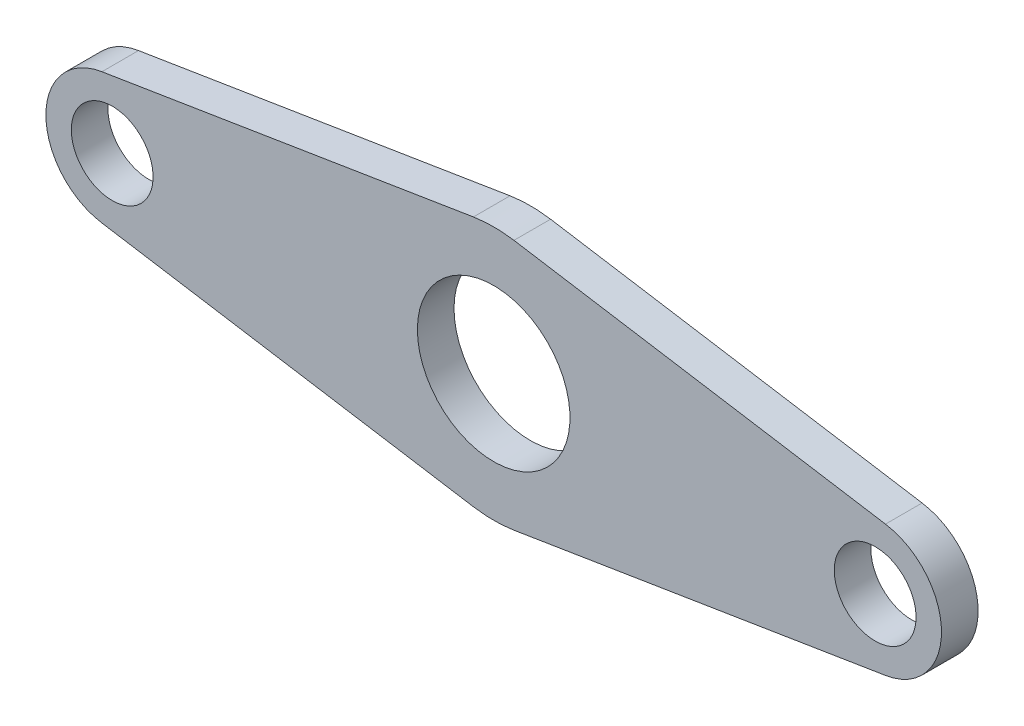
ISO-10303-21;
HEADER;
FILE_DESCRIPTION(('STEP AP214'),'2;1');
FILE_NAME('part.step','',(''),(''),'','','');
FILE_SCHEMA(('AUTOMOTIVE_DESIGN { 1 0 10303 214 1 1 1 1 }'));
ENDSEC;
DATA;
#1=APPLICATION_CONTEXT('core data for automotive mechanical design processes');
#2=APPLICATION_PROTOCOL_DEFINITION('international standard','automotive_design',2000,#1);
#3=PRODUCT_CONTEXT('',#1,'mechanical');
#4=PRODUCT('Part','Part','',(#3));
#5=PRODUCT_RELATED_PRODUCT_CATEGORY('part','',(#4));
#6=PRODUCT_DEFINITION_FORMATION('','',#4);
#7=PRODUCT_DEFINITION_CONTEXT('part definition',#1,'design');
#8=PRODUCT_DEFINITION('design','',#6,#7);
#9=PRODUCT_DEFINITION_SHAPE('','',#8);
#10=(LENGTH_UNIT() NAMED_UNIT(*) SI_UNIT(.MILLI.,.METRE.));
#11=(NAMED_UNIT(*) PLANE_ANGLE_UNIT() SI_UNIT($,.RADIAN.));
#12=(NAMED_UNIT(*) SI_UNIT($,.STERADIAN.) SOLID_ANGLE_UNIT());
#13=UNCERTAINTY_MEASURE_WITH_UNIT(LENGTH_MEASURE(1.E-05),#10,'distance_accuracy_value','');
#14=(GEOMETRIC_REPRESENTATION_CONTEXT(3) GLOBAL_UNCERTAINTY_ASSIGNED_CONTEXT((#13)) GLOBAL_UNIT_ASSIGNED_CONTEXT((#10,
#11,#12)) REPRESENTATION_CONTEXT('',''));
#15=CARTESIAN_POINT('',(0.,0.,0.));
#16=DIRECTION('',(0.,0.,1.));
#17=DIRECTION('',(1.,0.,0.));
#18=AXIS2_PLACEMENT_3D('',#15,#16,#17);
#19=CARTESIAN_POINT('',(0.,0.,1.143));
#20=DIRECTION('',(0.,0.,1.));
#21=DIRECTION('',(1.,0.,0.));
#22=AXIS2_PLACEMENT_3D('',#19,#20,#21);
#23=PLANE('',#22);
#24=CARTESIAN_POINT('',(-23.8125,0.,1.143));
#25=DIRECTION('',(0.,0.,-1.));
#26=DIRECTION('',(-1.,0.,0.));
#27=AXIS2_PLACEMENT_3D('',#24,#25,#26);
#28=CIRCLE('',#27,2.5527);
#29=CARTESIAN_POINT('',(-26.3652,0.,1.143));
#30=VERTEX_POINT('',#29);
#31=EDGE_CURVE('E139',#30,#30,#28,.T.);
#32=ORIENTED_EDGE('',*,*,#31,.T.);
#33=EDGE_LOOP('',(#32));
#34=FACE_BOUND('',#33,.T.);
#35=CARTESIAN_POINT('',(23.8125,0.,1.143));
#36=DIRECTION('',(0.,0.,-1.));
#37=DIRECTION('',(-1.,0.,0.));
#38=AXIS2_PLACEMENT_3D('',#35,#36,#37);
#39=CIRCLE('',#38,2.5527);
#40=CARTESIAN_POINT('',(21.2598,0.,1.143));
#41=VERTEX_POINT('',#40);
#42=EDGE_CURVE('E142',#41,#41,#39,.T.);
#43=ORIENTED_EDGE('',*,*,#42,.T.);
#44=EDGE_LOOP('',(#43));
#45=FACE_BOUND('',#44,.T.);
#46=CARTESIAN_POINT('',(0.,0.,1.143));
#47=DIRECTION('',(0.,0.,-1.));
#48=DIRECTION('',(-1.,0.,0.));
#49=AXIS2_PLACEMENT_3D('',#46,#47,#48);
#50=CIRCLE('',#49,7.93637059394939);
#51=CARTESIAN_POINT('',(-1.26522174657095,7.83487026928393,1.143));
#52=VERTEX_POINT('',#51);
#53=CARTESIAN_POINT('',(1.26522174657097,7.83487026928394,1.143));
#54=VERTEX_POINT('',#53);
#55=EDGE_CURVE('E115',#52,#54,#50,.T.);
#56=ORIENTED_EDGE('',*,*,#55,.F.);
#57=DIRECTION('',(-0.987210737771887,-0.15942069886902,0.));
#58=VECTOR('',#57,1.);
#59=CARTESIAN_POINT('',(-1.26522174657096,7.83487026928393,1.143));
#60=LINE('',#59,#58);
#61=CARTESIAN_POINT('',(-24.4557704638494,4.08992165577031,1.143));
#62=VERTEX_POINT('',#61);
#63=EDGE_CURVE('E91',#62,#52,#60,.F.);
#64=ORIENTED_EDGE('',*,*,#63,.F.);
#65=CARTESIAN_POINT('',(-23.8125,0.,1.143));
#66=DIRECTION('',(0.,0.,-1.));
#67=DIRECTION('',(-1.,0.,0.));
#68=AXIS2_PLACEMENT_3D('',#65,#66,#67);
#69=CIRCLE('',#68,4.1402);
#70=CARTESIAN_POINT('',(-24.4557704638489,-4.08992165577039,1.143));
#71=VERTEX_POINT('',#70);
#72=EDGE_CURVE('E85',#71,#62,#69,.T.);
#73=ORIENTED_EDGE('',*,*,#72,.F.);
#74=DIRECTION('',(-0.987210737771887,0.15942069886902,0.));
#75=VECTOR('',#74,1.);
#76=CARTESIAN_POINT('',(-1.26522174657096,-7.83487026928393,1.143));
#77=LINE('',#76,#75);
#78=CARTESIAN_POINT('',(-1.26522174657096,-7.83487026928393,1.143));
#79=VERTEX_POINT('',#78);
#80=EDGE_CURVE('E89',#71,#79,#77,.F.);
#81=ORIENTED_EDGE('',*,*,#80,.T.);
#82=CARTESIAN_POINT('',(0.,0.,1.143));
#83=DIRECTION('',(0.,0.,-1.));
#84=DIRECTION('',(-1.,0.,0.));
#85=AXIS2_PLACEMENT_3D('',#82,#83,#84);
#86=CIRCLE('',#85,7.93637059394946);
#87=CARTESIAN_POINT('',(1.26522174657096,-7.83487026928393,1.143));
#88=VERTEX_POINT('',#87);
#89=EDGE_CURVE('E80',#88,#79,#86,.T.);
#90=ORIENTED_EDGE('',*,*,#89,.F.);
#91=DIRECTION('',(0.987210737771887,0.159420698869021,0.));
#92=VECTOR('',#91,1.);
#93=CARTESIAN_POINT('',(1.26522174657096,-7.83487026928393,1.143));
#94=LINE('',#93,#92);
#95=CARTESIAN_POINT('',(24.4557704638474,-4.08992165577062,1.143));
#96=VERTEX_POINT('',#95);
#97=EDGE_CURVE('E117',#96,#88,#94,.F.);
#98=ORIENTED_EDGE('',*,*,#97,.F.);
#99=CARTESIAN_POINT('',(23.8125,0.,1.143));
#100=DIRECTION('',(0.,0.,-1.));
#101=DIRECTION('',(-1.,0.,0.));
#102=AXIS2_PLACEMENT_3D('',#99,#100,#101);
#103=CIRCLE('',#102,4.1402);
#104=CARTESIAN_POINT('',(24.4557704638452,4.08992165577098,1.143));
#105=VERTEX_POINT('',#104);
#106=EDGE_CURVE('E146',#105,#96,#103,.T.);
#107=ORIENTED_EDGE('',*,*,#106,.F.);
#108=DIRECTION('',(0.987210737771887,-0.159420698869021,0.));
#109=VECTOR('',#108,1.);
#110=CARTESIAN_POINT('',(1.26522174657097,7.83487026928394,1.143));
#111=LINE('',#110,#109);
#112=EDGE_CURVE('E112',#105,#54,#111,.F.);
#113=ORIENTED_EDGE('',*,*,#112,.T.);
#114=EDGE_LOOP('',(#56,#64,#73,#81,#90,#98,#107,#113));
#115=FACE_BOUND('',#114,.T.);
#116=CARTESIAN_POINT('',(0.,0.,1.143));
#117=DIRECTION('',(0.,0.,-1.));
#118=DIRECTION('',(-1.,0.,0.));
#119=AXIS2_PLACEMENT_3D('',#116,#117,#118);
#120=CIRCLE('',#119,4.7625);
#121=CARTESIAN_POINT('',(-4.7625,0.,1.143));
#122=VERTEX_POINT('',#121);
#123=EDGE_CURVE('E20',#122,#122,#120,.T.);
#124=ORIENTED_EDGE('',*,*,#123,.T.);
#125=EDGE_LOOP('',(#124));
#126=FACE_BOUND('',#125,.T.);
#127=ADVANCED_FACE('F17',(#34,#45,#115,#126),#23,.T.);
#128=CARTESIAN_POINT('',(0.,0.,1.143));
#129=DIRECTION('',(0.,0.,-1.));
#130=DIRECTION('',(-1.,0.,0.));
#131=AXIS2_PLACEMENT_3D('',#128,#129,#130);
#132=CYLINDRICAL_SURFACE('',#131,4.7625);
#133=CARTESIAN_POINT('',(0.,0.,-1.143));
#134=DIRECTION('',(0.,0.,-1.));
#135=DIRECTION('',(-1.,0.,0.));
#136=AXIS2_PLACEMENT_3D('',#133,#134,#135);
#137=CIRCLE('',#136,4.7625);
#138=CARTESIAN_POINT('',(-4.7625,0.,-1.143));
#139=VERTEX_POINT('',#138);
#140=EDGE_CURVE('E136',#139,#139,#137,.T.);
#141=ORIENTED_EDGE('',*,*,#140,.T.);
#142=EDGE_LOOP('',(#141));
#143=FACE_BOUND('',#142,.T.);
#144=ORIENTED_EDGE('',*,*,#123,.F.);
#145=EDGE_LOOP('',(#144));
#146=FACE_BOUND('',#145,.T.);
#147=ADVANCED_FACE('F281',(#143,#146),#132,.F.);
#148=CARTESIAN_POINT('',(-1.26522174657096,-7.83487026928393,1.143));
#149=DIRECTION('',(0.15942069886902,0.987210737771887,0.));
#150=DIRECTION('',(-0.987210737771887,0.15942069886902,0.));
#151=AXIS2_PLACEMENT_3D('',#148,#149,#150);
#152=PLANE('',#151);
#153=DIRECTION('',(0.,0.,-1.));
#154=VECTOR('',#153,1.);
#155=CARTESIAN_POINT('',(-1.26522174657095,-7.83487026928393,1.143));
#156=LINE('',#155,#154);
#157=CARTESIAN_POINT('',(-1.26522174657096,-7.83487026928393,-1.143));
#158=VERTEX_POINT('',#157);
#159=EDGE_CURVE('E102',#79,#158,#156,.T.);
#160=ORIENTED_EDGE('',*,*,#159,.F.);
#161=ORIENTED_EDGE('',*,*,#80,.F.);
#162=DIRECTION('',(0.,0.,1.));
#163=VECTOR('',#162,1.);
#164=CARTESIAN_POINT('',(-24.4557704638494,-4.08992165577032,1.143));
#165=LINE('',#164,#163);
#166=CARTESIAN_POINT('',(-24.455770463849,-4.08992165577037,-1.143));
#167=VERTEX_POINT('',#166);
#168=EDGE_CURVE('E101',#167,#71,#165,.T.);
#169=ORIENTED_EDGE('',*,*,#168,.F.);
#170=DIRECTION('',(0.987210737771887,-0.15942069886902,0.));
#171=VECTOR('',#170,1.);
#172=CARTESIAN_POINT('',(-24.4557704638493,-4.08992165577032,-1.143));
#173=LINE('',#172,#171);
#174=EDGE_CURVE('E134',#167,#158,#173,.T.);
#175=ORIENTED_EDGE('',*,*,#174,.T.);
#176=EDGE_LOOP('',(#160,#161,#169,#175));
#177=FACE_BOUND('',#176,.T.);
#178=ADVANCED_FACE('F99',(#177),#152,.F.);
#179=CARTESIAN_POINT('',(0.,0.,1.143));
#180=DIRECTION('',(0.,0.,-1.));
#181=DIRECTION('',(-1.,0.,0.));
#182=AXIS2_PLACEMENT_3D('',#179,#180,#181);
#183=CYLINDRICAL_SURFACE('',#182,7.93637059394946);
#184=ORIENTED_EDGE('',*,*,#89,.T.);
#185=ORIENTED_EDGE('',*,*,#159,.T.);
#186=CARTESIAN_POINT('',(0.,0.,-1.143));
#187=DIRECTION('',(0.,0.,-1.));
#188=DIRECTION('',(-1.,0.,0.));
#189=AXIS2_PLACEMENT_3D('',#186,#187,#188);
#190=CIRCLE('',#189,7.93637059394946);
#191=CARTESIAN_POINT('',(1.26522174657096,-7.83487026928393,-1.143));
#192=VERTEX_POINT('',#191);
#193=EDGE_CURVE('E131',#158,#192,#190,.F.);
#194=ORIENTED_EDGE('',*,*,#193,.T.);
#195=DIRECTION('',(0.,0.,1.));
#196=VECTOR('',#195,1.);
#197=CARTESIAN_POINT('',(1.26522174657096,-7.83487026928393,1.143));
#198=LINE('',#197,#196);
#199=EDGE_CURVE('E118',#88,#192,#198,.F.);
#200=ORIENTED_EDGE('',*,*,#199,.F.);
#201=EDGE_LOOP('',(#184,#185,#194,#200));
#202=FACE_BOUND('',#201,.T.);
#203=ADVANCED_FACE('F149',(#202),#183,.T.);
#204=CARTESIAN_POINT('',(1.26522174657096,-7.83487026928393,1.143));
#205=DIRECTION('',(0.159420698869021,-0.987210737771887,0.));
#206=DIRECTION('',(0.987210737771887,0.159420698869021,0.));
#207=AXIS2_PLACEMENT_3D('',#204,#205,#206);
#208=PLANE('',#207);
#209=ORIENTED_EDGE('',*,*,#97,.T.);
#210=ORIENTED_EDGE('',*,*,#199,.T.);
#211=DIRECTION('',(0.987210737771887,0.159420698869021,0.));
#212=VECTOR('',#211,1.);
#213=CARTESIAN_POINT('',(1.26522174657096,-7.83487026928393,-1.143));
#214=LINE('',#213,#212);
#215=CARTESIAN_POINT('',(24.4557704638476,-4.08992165577059,-1.143));
#216=VERTEX_POINT('',#215);
#217=EDGE_CURVE('E130',#192,#216,#214,.T.);
#218=ORIENTED_EDGE('',*,*,#217,.T.);
#219=DIRECTION('',(0.,0.,-1.));
#220=VECTOR('',#219,1.);
#221=CARTESIAN_POINT('',(24.4557704638478,-4.08992165577056,1.143));
#222=LINE('',#221,#220);
#223=EDGE_CURVE('E147',#96,#216,#222,.T.);
#224=ORIENTED_EDGE('',*,*,#223,.F.);
#225=EDGE_LOOP('',(#209,#210,#218,#224));
#226=FACE_BOUND('',#225,.T.);
#227=ADVANCED_FACE('F165',(#226),#208,.T.);
#228=CARTESIAN_POINT('',(23.8125,0.,1.143));
#229=DIRECTION('',(0.,0.,-1.));
#230=DIRECTION('',(-1.,0.,0.));
#231=AXIS2_PLACEMENT_3D('',#228,#229,#230);
#232=CYLINDRICAL_SURFACE('',#231,4.1402);
#233=ORIENTED_EDGE('',*,*,#106,.T.);
#234=ORIENTED_EDGE('',*,*,#223,.T.);
#235=CARTESIAN_POINT('',(23.8125,0.,-1.143));
#236=DIRECTION('',(0.,0.,-1.));
#237=DIRECTION('',(-1.,0.,0.));
#238=AXIS2_PLACEMENT_3D('',#235,#236,#237);
#239=CIRCLE('',#238,4.1402);
#240=CARTESIAN_POINT('',(24.4557704638451,4.089921655771,-1.143));
#241=VERTEX_POINT('',#240);
#242=EDGE_CURVE('E127',#216,#241,#239,.F.);
#243=ORIENTED_EDGE('',*,*,#242,.T.);
#244=DIRECTION('',(0.,0.,1.));
#245=VECTOR('',#244,1.);
#246=CARTESIAN_POINT('',(24.4557704638451,4.089921655771,1.143));
#247=LINE('',#246,#245);
#248=EDGE_CURVE('E116',#241,#105,#247,.T.);
#249=ORIENTED_EDGE('',*,*,#248,.T.);
#250=EDGE_LOOP('',(#233,#234,#243,#249));
#251=FACE_BOUND('',#250,.T.);
#252=ADVANCED_FACE('F175',(#251),#232,.T.);
#253=CARTESIAN_POINT('',(1.26522174657097,7.83487026928394,1.143));
#254=DIRECTION('',(-0.159420698869021,-0.987210737771887,0.));
#255=DIRECTION('',(0.987210737771887,-0.159420698869021,0.));
#256=AXIS2_PLACEMENT_3D('',#253,#254,#255);
#257=PLANE('',#256);
#258=DIRECTION('',(0.,0.,-1.));
#259=VECTOR('',#258,1.);
#260=CARTESIAN_POINT('',(1.26522174657097,7.83487026928394,1.143));
#261=LINE('',#260,#259);
#262=CARTESIAN_POINT('',(1.26522174657097,7.83487026928394,-1.143));
#263=VERTEX_POINT('',#262);
#264=EDGE_CURVE('E111',#54,#263,#261,.T.);
#265=ORIENTED_EDGE('',*,*,#264,.F.);
#266=ORIENTED_EDGE('',*,*,#112,.F.);
#267=ORIENTED_EDGE('',*,*,#248,.F.);
#268=DIRECTION('',(-0.987210737771887,0.159420698869021,0.));
#269=VECTOR('',#268,1.);
#270=CARTESIAN_POINT('',(24.4557704638451,4.089921655771,-1.143));
#271=LINE('',#270,#269);
#272=EDGE_CURVE('E126',#241,#263,#271,.T.);
#273=ORIENTED_EDGE('',*,*,#272,.T.);
#274=EDGE_LOOP('',(#265,#266,#267,#273));
#275=FACE_BOUND('',#274,.T.);
#276=ADVANCED_FACE('F172',(#275),#257,.F.);
#277=CARTESIAN_POINT('',(0.,0.,1.143));
#278=DIRECTION('',(0.,0.,-1.));
#279=DIRECTION('',(-1.,0.,0.));
#280=AXIS2_PLACEMENT_3D('',#277,#278,#279);
#281=CYLINDRICAL_SURFACE('',#280,7.93637059394939);
#282=ORIENTED_EDGE('',*,*,#55,.T.);
#283=ORIENTED_EDGE('',*,*,#264,.T.);
#284=CARTESIAN_POINT('',(0.,0.,-1.143));
#285=DIRECTION('',(0.,0.,-1.));
#286=DIRECTION('',(-1.,0.,0.));
#287=AXIS2_PLACEMENT_3D('',#284,#285,#286);
#288=CIRCLE('',#287,7.93637059394939);
#289=CARTESIAN_POINT('',(-1.26522174657095,7.83487026928393,-1.143));
#290=VERTEX_POINT('',#289);
#291=EDGE_CURVE('E123',#263,#290,#288,.F.);
#292=ORIENTED_EDGE('',*,*,#291,.T.);
#293=DIRECTION('',(0.,0.,1.));
#294=VECTOR('',#293,1.);
#295=CARTESIAN_POINT('',(-1.26522174657095,7.83487026928393,1.143));
#296=LINE('',#295,#294);
#297=EDGE_CURVE('E96',#52,#290,#296,.F.);
#298=ORIENTED_EDGE('',*,*,#297,.F.);
#299=EDGE_LOOP('',(#282,#283,#292,#298));
#300=FACE_BOUND('',#299,.T.);
#301=ADVANCED_FACE('F183',(#300),#281,.T.);
#302=CARTESIAN_POINT('',(-1.26522174657096,7.83487026928393,1.143));
#303=DIRECTION('',(-0.15942069886902,0.987210737771887,0.));
#304=DIRECTION('',(-0.987210737771887,-0.15942069886902,0.));
#305=AXIS2_PLACEMENT_3D('',#302,#303,#304);
#306=PLANE('',#305);
#307=ORIENTED_EDGE('',*,*,#63,.T.);
#308=ORIENTED_EDGE('',*,*,#297,.T.);
#309=DIRECTION('',(-0.987210737771887,-0.15942069886902,0.));
#310=VECTOR('',#309,1.);
#311=CARTESIAN_POINT('',(-1.26522174657095,7.83487026928393,-1.143));
#312=LINE('',#311,#310);
#313=CARTESIAN_POINT('',(-24.4557704638494,4.08992165577031,-1.143));
#314=VERTEX_POINT('',#313);
#315=EDGE_CURVE('E122',#290,#314,#312,.T.);
#316=ORIENTED_EDGE('',*,*,#315,.T.);
#317=DIRECTION('',(0.,0.,-1.));
#318=VECTOR('',#317,1.);
#319=CARTESIAN_POINT('',(-24.4557704638493,4.08992165577032,1.143));
#320=LINE('',#319,#318);
#321=EDGE_CURVE('E95',#62,#314,#320,.T.);
#322=ORIENTED_EDGE('',*,*,#321,.F.);
#323=EDGE_LOOP('',(#307,#308,#316,#322));
#324=FACE_BOUND('',#323,.T.);
#325=ADVANCED_FACE('F180',(#324),#306,.T.);
#326=CARTESIAN_POINT('',(-23.8125,0.,1.143));
#327=DIRECTION('',(0.,0.,-1.));
#328=DIRECTION('',(-1.,0.,0.));
#329=AXIS2_PLACEMENT_3D('',#326,#327,#328);
#330=CYLINDRICAL_SURFACE('',#329,4.1402);
#331=ORIENTED_EDGE('',*,*,#321,.T.);
#332=CARTESIAN_POINT('',(-23.8125,0.,-1.143));
#333=DIRECTION('',(0.,0.,-1.));
#334=DIRECTION('',(-1.,0.,0.));
#335=AXIS2_PLACEMENT_3D('',#332,#333,#334);
#336=CIRCLE('',#335,4.1402);
#337=EDGE_CURVE('E35',#314,#167,#336,.F.);
#338=ORIENTED_EDGE('',*,*,#337,.T.);
#339=ORIENTED_EDGE('',*,*,#168,.T.);
#340=ORIENTED_EDGE('',*,*,#72,.T.);
#341=EDGE_LOOP('',(#331,#338,#339,#340));
#342=FACE_BOUND('',#341,.T.);
#343=ADVANCED_FACE('F104',(#342),#330,.T.);
#344=CARTESIAN_POINT('',(23.8125,0.,1.143));
#345=DIRECTION('',(0.,0.,-1.));
#346=DIRECTION('',(-1.,0.,0.));
#347=AXIS2_PLACEMENT_3D('',#344,#345,#346);
#348=CYLINDRICAL_SURFACE('',#347,2.5527);
#349=CARTESIAN_POINT('',(23.8125,0.,-1.143));
#350=DIRECTION('',(0.,0.,-1.));
#351=DIRECTION('',(-1.,0.,0.));
#352=AXIS2_PLACEMENT_3D('',#349,#350,#351);
#353=CIRCLE('',#352,2.5527);
#354=CARTESIAN_POINT('',(21.2598,0.,-1.143));
#355=VERTEX_POINT('',#354);
#356=EDGE_CURVE('E26',#355,#355,#353,.T.);
#357=ORIENTED_EDGE('',*,*,#356,.T.);
#358=EDGE_LOOP('',(#357));
#359=FACE_BOUND('',#358,.T.);
#360=ORIENTED_EDGE('',*,*,#42,.F.);
#361=EDGE_LOOP('',(#360));
#362=FACE_BOUND('',#361,.T.);
#363=ADVANCED_FACE('F200',(#359,#362),#348,.F.);
#364=CARTESIAN_POINT('',(-23.8125,0.,1.143));
#365=DIRECTION('',(0.,0.,-1.));
#366=DIRECTION('',(-1.,0.,0.));
#367=AXIS2_PLACEMENT_3D('',#364,#365,#366);
#368=CYLINDRICAL_SURFACE('',#367,2.5527);
#369=CARTESIAN_POINT('',(-23.8125,0.,-1.143));
#370=DIRECTION('',(0.,0.,-1.));
#371=DIRECTION('',(-1.,0.,0.));
#372=AXIS2_PLACEMENT_3D('',#369,#370,#371);
#373=CIRCLE('',#372,2.5527);
#374=CARTESIAN_POINT('',(-26.3652,0.,-1.143));
#375=VERTEX_POINT('',#374);
#376=EDGE_CURVE('E11',#375,#375,#373,.T.);
#377=ORIENTED_EDGE('',*,*,#376,.T.);
#378=EDGE_LOOP('',(#377));
#379=FACE_BOUND('',#378,.T.);
#380=ORIENTED_EDGE('',*,*,#31,.F.);
#381=EDGE_LOOP('',(#380));
#382=FACE_BOUND('',#381,.T.);
#383=ADVANCED_FACE('F194',(#379,#382),#368,.F.);
#384=CARTESIAN_POINT('',(0.,0.,-1.143));
#385=DIRECTION('',(0.,0.,1.));
#386=DIRECTION('',(1.,0.,0.));
#387=AXIS2_PLACEMENT_3D('',#384,#385,#386);
#388=PLANE('',#387);
#389=ORIENTED_EDGE('',*,*,#376,.F.);
#390=EDGE_LOOP('',(#389));
#391=FACE_BOUND('',#390,.T.);
#392=ORIENTED_EDGE('',*,*,#356,.F.);
#393=EDGE_LOOP('',(#392));
#394=FACE_BOUND('',#393,.T.);
#395=ORIENTED_EDGE('',*,*,#315,.F.);
#396=ORIENTED_EDGE('',*,*,#291,.F.);
#397=ORIENTED_EDGE('',*,*,#272,.F.);
#398=ORIENTED_EDGE('',*,*,#242,.F.);
#399=ORIENTED_EDGE('',*,*,#217,.F.);
#400=ORIENTED_EDGE('',*,*,#193,.F.);
#401=ORIENTED_EDGE('',*,*,#174,.F.);
#402=ORIENTED_EDGE('',*,*,#337,.F.);
#403=EDGE_LOOP('',(#395,#396,#397,#398,#399,#400,#401,#402));
#404=FACE_BOUND('',#403,.T.);
#405=ORIENTED_EDGE('',*,*,#140,.F.);
#406=EDGE_LOOP('',(#405));
#407=FACE_BOUND('',#406,.T.);
#408=ADVANCED_FACE('F151',(#391,#394,#404,#407),#388,.F.);
#409=CLOSED_SHELL('',(#127,#147,#178,#203,#227,#252,#276,#301,#325,#343,#363,#383,#408));
#410=MANIFOLD_SOLID_BREP('B1',#409);
#411=ADVANCED_BREP_SHAPE_REPRESENTATION('',(#18,#410),#14);
#412=SHAPE_DEFINITION_REPRESENTATION(#9,#411);
ENDSEC;
END-ISO-10303-21;
